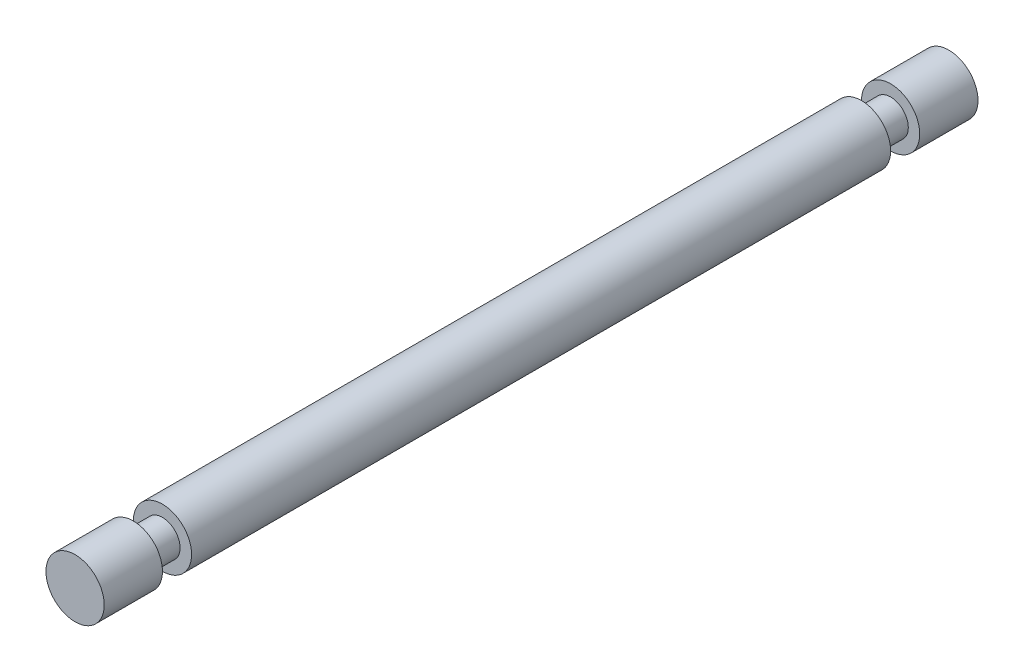
ISO-10303-21;
HEADER;
FILE_DESCRIPTION(('STEP AP214'),'2;1');
FILE_NAME('part.step','',(''),(''),'','','');
FILE_SCHEMA(('AUTOMOTIVE_DESIGN { 1 0 10303 214 1 1 1 1 }'));
ENDSEC;
DATA;
#1=APPLICATION_CONTEXT('core data for automotive mechanical design processes');
#2=APPLICATION_PROTOCOL_DEFINITION('international standard','automotive_design',2000,#1);
#3=PRODUCT_CONTEXT('',#1,'mechanical');
#4=PRODUCT('Part','Part','',(#3));
#5=PRODUCT_RELATED_PRODUCT_CATEGORY('part','',(#4));
#6=PRODUCT_DEFINITION_FORMATION('','',#4);
#7=PRODUCT_DEFINITION_CONTEXT('part definition',#1,'design');
#8=PRODUCT_DEFINITION('design','',#6,#7);
#9=PRODUCT_DEFINITION_SHAPE('','',#8);
#10=(LENGTH_UNIT() NAMED_UNIT(*) SI_UNIT(.MILLI.,.METRE.));
#11=(NAMED_UNIT(*) PLANE_ANGLE_UNIT() SI_UNIT($,.RADIAN.));
#12=(NAMED_UNIT(*) SI_UNIT($,.STERADIAN.) SOLID_ANGLE_UNIT());
#13=UNCERTAINTY_MEASURE_WITH_UNIT(LENGTH_MEASURE(1.E-05),#10,'distance_accuracy_value','');
#14=(GEOMETRIC_REPRESENTATION_CONTEXT(3) GLOBAL_UNCERTAINTY_ASSIGNED_CONTEXT((#13)) GLOBAL_UNIT_ASSIGNED_CONTEXT((#10,
#11,#12)) REPRESENTATION_CONTEXT('',''));
#15=CARTESIAN_POINT('',(0.,0.,0.));
#16=DIRECTION('',(0.,0.,1.));
#17=DIRECTION('',(1.,0.,0.));
#18=AXIS2_PLACEMENT_3D('',#15,#16,#17);
#19=CARTESIAN_POINT('',(0.,0.,0.));
#20=DIRECTION('',(0.,0.,1.));
#21=DIRECTION('',(1.,0.,0.));
#22=AXIS2_PLACEMENT_3D('',#19,#20,#21);
#23=CYLINDRICAL_SURFACE('',#22,1.27);
#24=CARTESIAN_POINT('',(0.,0.,-2.54));
#25=DIRECTION('',(0.,0.,1.));
#26=DIRECTION('',(1.,0.,0.));
#27=AXIS2_PLACEMENT_3D('',#24,#25,#26);
#28=CIRCLE('',#27,1.27);
#29=CARTESIAN_POINT('',(1.27,0.,-2.54));
#30=VERTEX_POINT('',#29);
#31=EDGE_CURVE('E40',#30,#30,#28,.T.);
#32=ORIENTED_EDGE('',*,*,#31,.T.);
#33=EDGE_LOOP('',(#32));
#34=FACE_BOUND('',#33,.T.);
#35=CARTESIAN_POINT('',(0.,0.,0.));
#36=DIRECTION('',(0.,0.,1.));
#37=DIRECTION('',(1.,0.,0.));
#38=AXIS2_PLACEMENT_3D('',#35,#36,#37);
#39=CIRCLE('',#38,1.27);
#40=CARTESIAN_POINT('',(1.27,0.,0.));
#41=VERTEX_POINT('',#40);
#42=EDGE_CURVE('E36',#41,#41,#39,.T.);
#43=ORIENTED_EDGE('',*,*,#42,.F.);
#44=EDGE_LOOP('',(#43));
#45=FACE_BOUND('',#44,.T.);
#46=ADVANCED_FACE('F29',(#34,#45),#23,.T.);
#47=CARTESIAN_POINT('',(0.,0.,0.));
#48=DIRECTION('',(0.,0.,1.));
#49=DIRECTION('',(1.,0.,0.));
#50=AXIS2_PLACEMENT_3D('',#47,#48,#49);
#51=PLANE('',#50);
#52=ORIENTED_EDGE('',*,*,#42,.T.);
#53=EDGE_LOOP('',(#52));
#54=FACE_BOUND('',#53,.T.);
#55=ADVANCED_FACE('F86',(#54),#51,.T.);
#56=CARTESIAN_POINT('',(1.27,0.,-2.54));
#57=DIRECTION('',(0.,0.,1.));
#58=DIRECTION('',(1.,0.,0.));
#59=AXIS2_PLACEMENT_3D('',#56,#57,#58);
#60=PLANE('',#59);
#61=ORIENTED_EDGE('',*,*,#31,.F.);
#62=EDGE_LOOP('',(#61));
#63=FACE_BOUND('',#62,.T.);
#64=CARTESIAN_POINT('',(0.,0.,-2.54));
#65=DIRECTION('',(0.,0.,1.));
#66=DIRECTION('',(1.,0.,0.));
#67=AXIS2_PLACEMENT_3D('',#64,#65,#66);
#68=CIRCLE('',#67,0.770587131468783);
#69=CARTESIAN_POINT('',(0.770587131468783,0.,-2.54));
#70=VERTEX_POINT('',#69);
#71=EDGE_CURVE('E44',#70,#70,#68,.T.);
#72=ORIENTED_EDGE('',*,*,#71,.T.);
#73=EDGE_LOOP('',(#72));
#74=FACE_BOUND('',#73,.T.);
#75=ADVANCED_FACE('F91',(#63,#74),#60,.F.);
#76=CARTESIAN_POINT('',(0.,0.,0.));
#77=DIRECTION('',(0.,0.,1.));
#78=DIRECTION('',(1.,0.,0.));
#79=AXIS2_PLACEMENT_3D('',#76,#77,#78);
#80=CYLINDRICAL_SURFACE('',#79,0.770587131468783);
#81=ORIENTED_EDGE('',*,*,#71,.F.);
#82=EDGE_LOOP('',(#81));
#83=FACE_BOUND('',#82,.T.);
#84=CARTESIAN_POINT('',(0.,0.,-3.81));
#85=DIRECTION('',(0.,0.,1.));
#86=DIRECTION('',(1.,0.,0.));
#87=AXIS2_PLACEMENT_3D('',#84,#85,#86);
#88=CIRCLE('',#87,0.770587131468783);
#89=CARTESIAN_POINT('',(0.770587131468783,0.,-3.81));
#90=VERTEX_POINT('',#89);
#91=EDGE_CURVE('E49',#90,#90,#88,.T.);
#92=ORIENTED_EDGE('',*,*,#91,.T.);
#93=EDGE_LOOP('',(#92));
#94=FACE_BOUND('',#93,.T.);
#95=ADVANCED_FACE('F113',(#83,#94),#80,.T.);
#96=CARTESIAN_POINT('',(0.770587131468783,0.,-3.81));
#97=DIRECTION('',(0.,0.,-1.));
#98=DIRECTION('',(-1.,0.,0.));
#99=AXIS2_PLACEMENT_3D('',#96,#97,#98);
#100=PLANE('',#99);
#101=ORIENTED_EDGE('',*,*,#91,.F.);
#102=EDGE_LOOP('',(#101));
#103=FACE_BOUND('',#102,.T.);
#104=CARTESIAN_POINT('',(0.,0.,-3.81));
#105=DIRECTION('',(0.,0.,1.));
#106=DIRECTION('',(1.,0.,0.));
#107=AXIS2_PLACEMENT_3D('',#104,#105,#106);
#108=CIRCLE('',#107,1.27);
#109=CARTESIAN_POINT('',(1.27,0.,-3.81));
#110=VERTEX_POINT('',#109);
#111=EDGE_CURVE('E52',#110,#110,#108,.T.);
#112=ORIENTED_EDGE('',*,*,#111,.T.);
#113=EDGE_LOOP('',(#112));
#114=FACE_BOUND('',#113,.T.);
#115=ADVANCED_FACE('F95',(#103,#114),#100,.F.);
#116=CARTESIAN_POINT('',(0.,0.,-34.29));
#117=DIRECTION('',(0.,0.,1.));
#118=DIRECTION('',(1.,0.,0.));
#119=AXIS2_PLACEMENT_3D('',#116,#117,#118);
#120=CIRCLE('',#119,1.27);
#121=CARTESIAN_POINT('',(1.27,0.,-34.29));
#122=VERTEX_POINT('',#121);
#123=EDGE_CURVE('E64',#122,#122,#120,.T.);
#124=ORIENTED_EDGE('',*,*,#123,.T.);
#125=EDGE_LOOP('',(#124));
#126=FACE_BOUND('',#125,.T.);
#127=ORIENTED_EDGE('',*,*,#111,.F.);
#128=EDGE_LOOP('',(#127));
#129=FACE_BOUND('',#128,.T.);
#130=ADVANCED_FACE('F68',(#126,#129),#23,.T.);
#131=CARTESIAN_POINT('',(1.27,0.,-35.56));
#132=DIRECTION('',(0.,0.,-1.));
#133=DIRECTION('',(1.,0.,0.));
#134=AXIS2_PLACEMENT_3D('',#131,#132,#133);
#135=PLANE('',#134);
#136=CARTESIAN_POINT('',(0.,0.,-35.56));
#137=DIRECTION('',(0.,0.,1.));
#138=DIRECTION('',(1.,0.,0.));
#139=AXIS2_PLACEMENT_3D('',#136,#137,#138);
#140=CIRCLE('',#139,1.27);
#141=CARTESIAN_POINT('',(1.27,0.,-35.56));
#142=VERTEX_POINT('',#141);
#143=EDGE_CURVE('E55',#142,#142,#140,.T.);
#144=ORIENTED_EDGE('',*,*,#143,.T.);
#145=EDGE_LOOP('',(#144));
#146=FACE_BOUND('',#145,.T.);
#147=CARTESIAN_POINT('',(0.,0.,-35.56));
#148=DIRECTION('',(0.,0.,1.));
#149=DIRECTION('',(1.,0.,0.));
#150=AXIS2_PLACEMENT_3D('',#147,#148,#149);
#151=CIRCLE('',#150,0.770587131468783);
#152=CARTESIAN_POINT('',(0.770587131468783,0.,-35.56));
#153=VERTEX_POINT('',#152);
#154=EDGE_CURVE('E58',#153,#153,#151,.T.);
#155=ORIENTED_EDGE('',*,*,#154,.F.);
#156=EDGE_LOOP('',(#155));
#157=FACE_BOUND('',#156,.T.);
#158=ADVANCED_FACE('F82',(#146,#157),#135,.F.);
#159=CARTESIAN_POINT('',(0.,0.,-38.1));
#160=DIRECTION('',(0.,0.,-1.));
#161=DIRECTION('',(1.,0.,0.));
#162=AXIS2_PLACEMENT_3D('',#159,#160,#161);
#163=CYLINDRICAL_SURFACE('',#162,0.770587131468783);
#164=ORIENTED_EDGE('',*,*,#154,.T.);
#165=EDGE_LOOP('',(#164));
#166=FACE_BOUND('',#165,.T.);
#167=CARTESIAN_POINT('',(0.,0.,-34.29));
#168=DIRECTION('',(0.,0.,1.));
#169=DIRECTION('',(1.,0.,0.));
#170=AXIS2_PLACEMENT_3D('',#167,#168,#169);
#171=CIRCLE('',#170,0.770587131468783);
#172=CARTESIAN_POINT('',(0.770587131468783,0.,-34.29));
#173=VERTEX_POINT('',#172);
#174=EDGE_CURVE('E61',#173,#173,#171,.T.);
#175=ORIENTED_EDGE('',*,*,#174,.F.);
#176=EDGE_LOOP('',(#175));
#177=FACE_BOUND('',#176,.T.);
#178=ADVANCED_FACE('F73',(#166,#177),#163,.T.);
#179=CARTESIAN_POINT('',(0.770587131468783,0.,-34.29));
#180=DIRECTION('',(0.,0.,1.));
#181=DIRECTION('',(-1.,0.,0.));
#182=AXIS2_PLACEMENT_3D('',#179,#180,#181);
#183=PLANE('',#182);
#184=ORIENTED_EDGE('',*,*,#174,.T.);
#185=EDGE_LOOP('',(#184));
#186=FACE_BOUND('',#185,.T.);
#187=ORIENTED_EDGE('',*,*,#123,.F.);
#188=EDGE_LOOP('',(#187));
#189=FACE_BOUND('',#188,.T.);
#190=ADVANCED_FACE('F71',(#186,#189),#183,.F.);
#191=CARTESIAN_POINT('',(0.,0.,-38.1));
#192=DIRECTION('',(0.,0.,-1.));
#193=DIRECTION('',(-1.,0.,0.));
#194=AXIS2_PLACEMENT_3D('',#191,#192,#193);
#195=PLANE('',#194);
#196=CARTESIAN_POINT('',(0.,0.,-38.1));
#197=DIRECTION('',(0.,0.,1.));
#198=DIRECTION('',(1.,0.,0.));
#199=AXIS2_PLACEMENT_3D('',#196,#197,#198);
#200=CIRCLE('',#199,1.27);
#201=CARTESIAN_POINT('',(1.27,0.,-38.1));
#202=VERTEX_POINT('',#201);
#203=EDGE_CURVE('E10',#202,#202,#200,.T.);
#204=ORIENTED_EDGE('',*,*,#203,.F.);
#205=EDGE_LOOP('',(#204));
#206=FACE_BOUND('',#205,.T.);
#207=ADVANCED_FACE('F31',(#206),#195,.T.);
#208=ORIENTED_EDGE('',*,*,#143,.F.);
#209=EDGE_LOOP('',(#208));
#210=FACE_BOUND('',#209,.T.);
#211=ORIENTED_EDGE('',*,*,#203,.T.);
#212=EDGE_LOOP('',(#211));
#213=FACE_BOUND('',#212,.T.);
#214=ADVANCED_FACE('F80',(#210,#213),#23,.T.);
#215=CLOSED_SHELL('',(#46,#55,#75,#95,#115,#130,#158,#178,#190,#207,#214));
#216=MANIFOLD_SOLID_BREP('B2',#215);
#217=ADVANCED_BREP_SHAPE_REPRESENTATION('',(#18,#216),#14);
#218=SHAPE_DEFINITION_REPRESENTATION(#9,#217);
ENDSEC;
END-ISO-10303-21;
